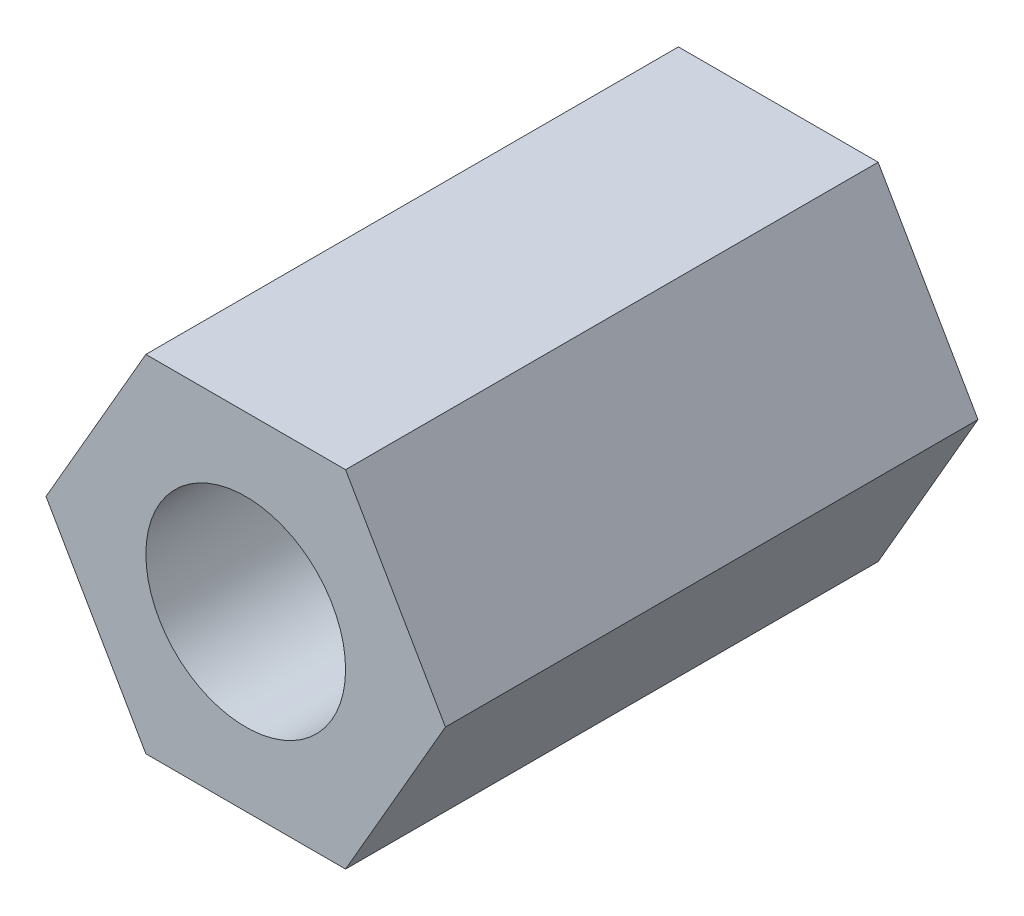
ISO-10303-21;
HEADER;
FILE_DESCRIPTION(('STEP AP214'),'2;1');
FILE_NAME('part.step','',(''),(''),'','','');
FILE_SCHEMA(('AUTOMOTIVE_DESIGN { 1 0 10303 214 1 1 1 1 }'));
ENDSEC;
DATA;
#1=APPLICATION_CONTEXT('core data for automotive mechanical design processes');
#2=APPLICATION_PROTOCOL_DEFINITION('international standard','automotive_design',2000,#1);
#3=PRODUCT_CONTEXT('',#1,'mechanical');
#4=PRODUCT('Part','Part','',(#3));
#5=PRODUCT_RELATED_PRODUCT_CATEGORY('part','',(#4));
#6=PRODUCT_DEFINITION_FORMATION('','',#4);
#7=PRODUCT_DEFINITION_CONTEXT('part definition',#1,'design');
#8=PRODUCT_DEFINITION('design','',#6,#7);
#9=PRODUCT_DEFINITION_SHAPE('','',#8);
#10=(LENGTH_UNIT() NAMED_UNIT(*) SI_UNIT(.MILLI.,.METRE.));
#11=(NAMED_UNIT(*) PLANE_ANGLE_UNIT() SI_UNIT($,.RADIAN.));
#12=(NAMED_UNIT(*) SI_UNIT($,.STERADIAN.) SOLID_ANGLE_UNIT());
#13=UNCERTAINTY_MEASURE_WITH_UNIT(LENGTH_MEASURE(1.E-05),#10,'distance_accuracy_value','');
#14=(GEOMETRIC_REPRESENTATION_CONTEXT(3) GLOBAL_UNCERTAINTY_ASSIGNED_CONTEXT((#13)) GLOBAL_UNIT_ASSIGNED_CONTEXT((#10,
#11,#12)) REPRESENTATION_CONTEXT('',''));
#15=CARTESIAN_POINT('',(0.,0.,0.));
#16=DIRECTION('',(0.,0.,1.));
#17=DIRECTION('',(1.,0.,0.));
#18=AXIS2_PLACEMENT_3D('',#15,#16,#17);
#19=CARTESIAN_POINT('',(0.,0.,8.));
#20=DIRECTION('',(0.,0.,1.));
#21=DIRECTION('',(1.,0.,0.));
#22=AXIS2_PLACEMENT_3D('',#19,#20,#21);
#23=PLANE('',#22);
#24=DIRECTION('',(-1.,0.,0.));
#25=VECTOR('',#24,1.);
#26=CARTESIAN_POINT('',(1.5,2.59807621135332,8.));
#27=LINE('',#26,#25);
#28=CARTESIAN_POINT('',(1.5,2.59807621135332,8.));
#29=VERTEX_POINT('',#28);
#30=CARTESIAN_POINT('',(-1.5,2.59807621135332,8.));
#31=VERTEX_POINT('',#30);
#32=EDGE_CURVE('E146',#29,#31,#27,.T.);
#33=ORIENTED_EDGE('',*,*,#32,.T.);
#34=DIRECTION('',(-0.5,-0.866025403784439,0.));
#35=VECTOR('',#34,1.);
#36=CARTESIAN_POINT('',(-1.5,2.59807621135332,8.));
#37=LINE('',#36,#35);
#38=CARTESIAN_POINT('',(-3.,0.,8.));
#39=VERTEX_POINT('',#38);
#40=EDGE_CURVE('E94',#31,#39,#37,.T.);
#41=ORIENTED_EDGE('',*,*,#40,.T.);
#42=DIRECTION('',(0.5,-0.866025403784439,0.));
#43=VECTOR('',#42,1.);
#44=CARTESIAN_POINT('',(-3.,0.,8.));
#45=LINE('',#44,#43);
#46=CARTESIAN_POINT('',(-1.5,-2.59807621135332,8.));
#47=VERTEX_POINT('',#46);
#48=EDGE_CURVE('E107',#39,#47,#45,.T.);
#49=ORIENTED_EDGE('',*,*,#48,.T.);
#50=DIRECTION('',(1.,0.,0.));
#51=VECTOR('',#50,1.);
#52=CARTESIAN_POINT('',(-1.5,-2.59807621135332,8.));
#53=LINE('',#52,#51);
#54=CARTESIAN_POINT('',(1.5,-2.59807621135332,8.));
#55=VERTEX_POINT('',#54);
#56=EDGE_CURVE('E101',#47,#55,#53,.T.);
#57=ORIENTED_EDGE('',*,*,#56,.T.);
#58=DIRECTION('',(0.5,0.866025403784439,0.));
#59=VECTOR('',#58,1.);
#60=CARTESIAN_POINT('',(1.5,-2.59807621135332,8.));
#61=LINE('',#60,#59);
#62=CARTESIAN_POINT('',(3.,0.,8.));
#63=VERTEX_POINT('',#62);
#64=EDGE_CURVE('E105',#55,#63,#61,.T.);
#65=ORIENTED_EDGE('',*,*,#64,.T.);
#66=DIRECTION('',(-0.5,0.866025403784439,0.));
#67=VECTOR('',#66,1.);
#68=CARTESIAN_POINT('',(3.,0.,8.));
#69=LINE('',#68,#67);
#70=EDGE_CURVE('E57',#63,#29,#69,.T.);
#71=ORIENTED_EDGE('',*,*,#70,.T.);
#72=EDGE_LOOP('',(#33,#41,#49,#57,#65,#71));
#73=FACE_BOUND('',#72,.T.);
#74=CARTESIAN_POINT('',(0.,0.,8.));
#75=DIRECTION('',(0.,0.,1.));
#76=DIRECTION('',(1.,0.,0.));
#77=AXIS2_PLACEMENT_3D('',#74,#75,#76);
#78=CIRCLE('',#77,1.5);
#79=CARTESIAN_POINT('',(1.5,0.,8.));
#80=VERTEX_POINT('',#79);
#81=EDGE_CURVE('E134',#80,#80,#78,.T.);
#82=ORIENTED_EDGE('',*,*,#81,.F.);
#83=EDGE_LOOP('',(#82));
#84=FACE_BOUND('',#83,.T.);
#85=ADVANCED_FACE('F39',(#73,#84),#23,.T.);
#86=CARTESIAN_POINT('',(0.,0.,0.));
#87=DIRECTION('',(0.,0.,1.));
#88=DIRECTION('',(1.,0.,0.));
#89=AXIS2_PLACEMENT_3D('',#86,#87,#88);
#90=PLANE('',#89);
#91=DIRECTION('',(-1.,0.,0.));
#92=VECTOR('',#91,1.);
#93=CARTESIAN_POINT('',(1.5,2.59807621135332,0.));
#94=LINE('',#93,#92);
#95=CARTESIAN_POINT('',(1.5,2.59807621135332,0.));
#96=VERTEX_POINT('',#95);
#97=CARTESIAN_POINT('',(-1.5,2.59807621135332,0.));
#98=VERTEX_POINT('',#97);
#99=EDGE_CURVE('E129',#96,#98,#94,.T.);
#100=ORIENTED_EDGE('',*,*,#99,.F.);
#101=DIRECTION('',(-0.5,0.866025403784439,0.));
#102=VECTOR('',#101,1.);
#103=CARTESIAN_POINT('',(3.,0.,0.));
#104=LINE('',#103,#102);
#105=CARTESIAN_POINT('',(3.,0.,0.));
#106=VERTEX_POINT('',#105);
#107=EDGE_CURVE('E86',#106,#96,#104,.T.);
#108=ORIENTED_EDGE('',*,*,#107,.F.);
#109=DIRECTION('',(0.5,0.866025403784439,0.));
#110=VECTOR('',#109,1.);
#111=CARTESIAN_POINT('',(1.5,-2.59807621135332,0.));
#112=LINE('',#111,#110);
#113=CARTESIAN_POINT('',(1.5,-2.59807621135332,0.));
#114=VERTEX_POINT('',#113);
#115=EDGE_CURVE('E80',#114,#106,#112,.T.);
#116=ORIENTED_EDGE('',*,*,#115,.F.);
#117=DIRECTION('',(1.,0.,0.));
#118=VECTOR('',#117,1.);
#119=CARTESIAN_POINT('',(-1.5,-2.59807621135332,0.));
#120=LINE('',#119,#118);
#121=CARTESIAN_POINT('',(-1.5,-2.59807621135332,0.));
#122=VERTEX_POINT('',#121);
#123=EDGE_CURVE('E116',#122,#114,#120,.T.);
#124=ORIENTED_EDGE('',*,*,#123,.F.);
#125=DIRECTION('',(0.5,-0.866025403784439,0.));
#126=VECTOR('',#125,1.);
#127=CARTESIAN_POINT('',(-3.,0.,0.));
#128=LINE('',#127,#126);
#129=CARTESIAN_POINT('',(-3.,0.,0.));
#130=VERTEX_POINT('',#129);
#131=EDGE_CURVE('E137',#130,#122,#128,.T.);
#132=ORIENTED_EDGE('',*,*,#131,.F.);
#133=DIRECTION('',(-0.5,-0.866025403784439,0.));
#134=VECTOR('',#133,1.);
#135=CARTESIAN_POINT('',(-1.5,2.59807621135332,0.));
#136=LINE('',#135,#134);
#137=EDGE_CURVE('E133',#98,#130,#136,.T.);
#138=ORIENTED_EDGE('',*,*,#137,.F.);
#139=EDGE_LOOP('',(#100,#108,#116,#124,#132,#138));
#140=FACE_BOUND('',#139,.T.);
#141=CARTESIAN_POINT('',(0.,0.,0.));
#142=DIRECTION('',(0.,0.,1.));
#143=DIRECTION('',(1.,0.,0.));
#144=AXIS2_PLACEMENT_3D('',#141,#142,#143);
#145=CIRCLE('',#144,1.5);
#146=CARTESIAN_POINT('',(1.5,0.,0.));
#147=VERTEX_POINT('',#146);
#148=EDGE_CURVE('E243',#147,#147,#145,.T.);
#149=ORIENTED_EDGE('',*,*,#148,.T.);
#150=EDGE_LOOP('',(#149));
#151=FACE_BOUND('',#150,.T.);
#152=ADVANCED_FACE('F159',(#140,#151),#90,.F.);
#153=CARTESIAN_POINT('',(1.5,2.59807621135332,8.));
#154=DIRECTION('',(0.,-1.,0.));
#155=DIRECTION('',(1.,0.,0.));
#156=AXIS2_PLACEMENT_3D('',#153,#154,#155);
#157=PLANE('',#156);
#158=ORIENTED_EDGE('',*,*,#99,.T.);
#159=DIRECTION('',(0.,0.,-1.));
#160=VECTOR('',#159,1.);
#161=CARTESIAN_POINT('',(-1.5,2.59807621135332,8.));
#162=LINE('',#161,#160);
#163=EDGE_CURVE('E11',#31,#98,#162,.T.);
#164=ORIENTED_EDGE('',*,*,#163,.F.);
#165=ORIENTED_EDGE('',*,*,#32,.F.);
#166=DIRECTION('',(0.,0.,-1.));
#167=VECTOR('',#166,1.);
#168=CARTESIAN_POINT('',(1.5,2.59807621135332,8.));
#169=LINE('',#168,#167);
#170=EDGE_CURVE('E125',#29,#96,#169,.T.);
#171=ORIENTED_EDGE('',*,*,#170,.T.);
#172=EDGE_LOOP('',(#158,#164,#165,#171));
#173=FACE_BOUND('',#172,.T.);
#174=ADVANCED_FACE('F41',(#173),#157,.F.);
#175=CARTESIAN_POINT('',(-1.5,2.59807621135332,8.));
#176=DIRECTION('',(0.866025403784439,-0.5,0.));
#177=DIRECTION('',(0.5,0.866025403784439,0.));
#178=AXIS2_PLACEMENT_3D('',#175,#176,#177);
#179=PLANE('',#178);
#180=ORIENTED_EDGE('',*,*,#137,.T.);
#181=DIRECTION('',(0.,0.,-1.));
#182=VECTOR('',#181,1.);
#183=CARTESIAN_POINT('',(-3.,0.,8.));
#184=LINE('',#183,#182);
#185=EDGE_CURVE('E49',#39,#130,#184,.T.);
#186=ORIENTED_EDGE('',*,*,#185,.F.);
#187=ORIENTED_EDGE('',*,*,#40,.F.);
#188=ORIENTED_EDGE('',*,*,#163,.T.);
#189=EDGE_LOOP('',(#180,#186,#187,#188));
#190=FACE_BOUND('',#189,.T.);
#191=ADVANCED_FACE('F184',(#190),#179,.F.);
#192=CARTESIAN_POINT('',(-3.,0.,8.));
#193=DIRECTION('',(0.866025403784439,0.5,0.));
#194=DIRECTION('',(-0.5,0.866025403784439,0.));
#195=AXIS2_PLACEMENT_3D('',#192,#193,#194);
#196=PLANE('',#195);
#197=ORIENTED_EDGE('',*,*,#131,.T.);
#198=DIRECTION('',(0.,0.,-1.));
#199=VECTOR('',#198,1.);
#200=CARTESIAN_POINT('',(-1.5,-2.59807621135332,8.));
#201=LINE('',#200,#199);
#202=EDGE_CURVE('E118',#47,#122,#201,.T.);
#203=ORIENTED_EDGE('',*,*,#202,.F.);
#204=ORIENTED_EDGE('',*,*,#48,.F.);
#205=ORIENTED_EDGE('',*,*,#185,.T.);
#206=EDGE_LOOP('',(#197,#203,#204,#205));
#207=FACE_BOUND('',#206,.T.);
#208=ADVANCED_FACE('F156',(#207),#196,.F.);
#209=CARTESIAN_POINT('',(-1.5,-2.59807621135332,8.));
#210=DIRECTION('',(0.,1.,0.));
#211=DIRECTION('',(-1.,0.,0.));
#212=AXIS2_PLACEMENT_3D('',#209,#210,#211);
#213=PLANE('',#212);
#214=ORIENTED_EDGE('',*,*,#123,.T.);
#215=DIRECTION('',(0.,0.,-1.));
#216=VECTOR('',#215,1.);
#217=CARTESIAN_POINT('',(1.5,-2.59807621135332,8.));
#218=LINE('',#217,#216);
#219=EDGE_CURVE('E113',#55,#114,#218,.T.);
#220=ORIENTED_EDGE('',*,*,#219,.F.);
#221=ORIENTED_EDGE('',*,*,#56,.F.);
#222=ORIENTED_EDGE('',*,*,#202,.T.);
#223=EDGE_LOOP('',(#214,#220,#221,#222));
#224=FACE_BOUND('',#223,.T.);
#225=ADVANCED_FACE('F114',(#224),#213,.F.);
#226=CARTESIAN_POINT('',(1.5,-2.59807621135332,8.));
#227=DIRECTION('',(-0.866025403784439,0.5,0.));
#228=DIRECTION('',(-0.5,-0.866025403784439,0.));
#229=AXIS2_PLACEMENT_3D('',#226,#227,#228);
#230=PLANE('',#229);
#231=ORIENTED_EDGE('',*,*,#115,.T.);
#232=DIRECTION('',(0.,0.,-1.));
#233=VECTOR('',#232,1.);
#234=CARTESIAN_POINT('',(3.,0.,8.));
#235=LINE('',#234,#233);
#236=EDGE_CURVE('E119',#63,#106,#235,.T.);
#237=ORIENTED_EDGE('',*,*,#236,.F.);
#238=ORIENTED_EDGE('',*,*,#64,.F.);
#239=ORIENTED_EDGE('',*,*,#219,.T.);
#240=EDGE_LOOP('',(#231,#237,#238,#239));
#241=FACE_BOUND('',#240,.T.);
#242=ADVANCED_FACE('F121',(#241),#230,.F.);
#243=CARTESIAN_POINT('',(3.,0.,8.));
#244=DIRECTION('',(-0.866025403784439,-0.5,0.));
#245=DIRECTION('',(0.5,-0.866025403784439,0.));
#246=AXIS2_PLACEMENT_3D('',#243,#244,#245);
#247=PLANE('',#246);
#248=ORIENTED_EDGE('',*,*,#107,.T.);
#249=ORIENTED_EDGE('',*,*,#170,.F.);
#250=ORIENTED_EDGE('',*,*,#70,.F.);
#251=ORIENTED_EDGE('',*,*,#236,.T.);
#252=EDGE_LOOP('',(#248,#249,#250,#251));
#253=FACE_BOUND('',#252,.T.);
#254=ADVANCED_FACE('F164',(#253),#247,.F.);
#255=CARTESIAN_POINT('',(0.,0.,8.));
#256=DIRECTION('',(0.,0.,-1.));
#257=DIRECTION('',(-1.,0.,0.));
#258=AXIS2_PLACEMENT_3D('',#255,#256,#257);
#259=CYLINDRICAL_SURFACE('',#258,1.5);
#260=ORIENTED_EDGE('',*,*,#81,.T.);
#261=EDGE_LOOP('',(#260));
#262=FACE_BOUND('',#261,.T.);
#263=ORIENTED_EDGE('',*,*,#148,.F.);
#264=EDGE_LOOP('',(#263));
#265=FACE_BOUND('',#264,.T.);
#266=ADVANCED_FACE('F166',(#262,#265),#259,.F.);
#267=CLOSED_SHELL('',(#85,#152,#174,#191,#208,#225,#242,#254,#266));
#268=MANIFOLD_SOLID_BREP('B2',#267);
#269=ADVANCED_BREP_SHAPE_REPRESENTATION('',(#18,#268),#14);
#270=SHAPE_DEFINITION_REPRESENTATION(#9,#269);
ENDSEC;
END-ISO-10303-21;
